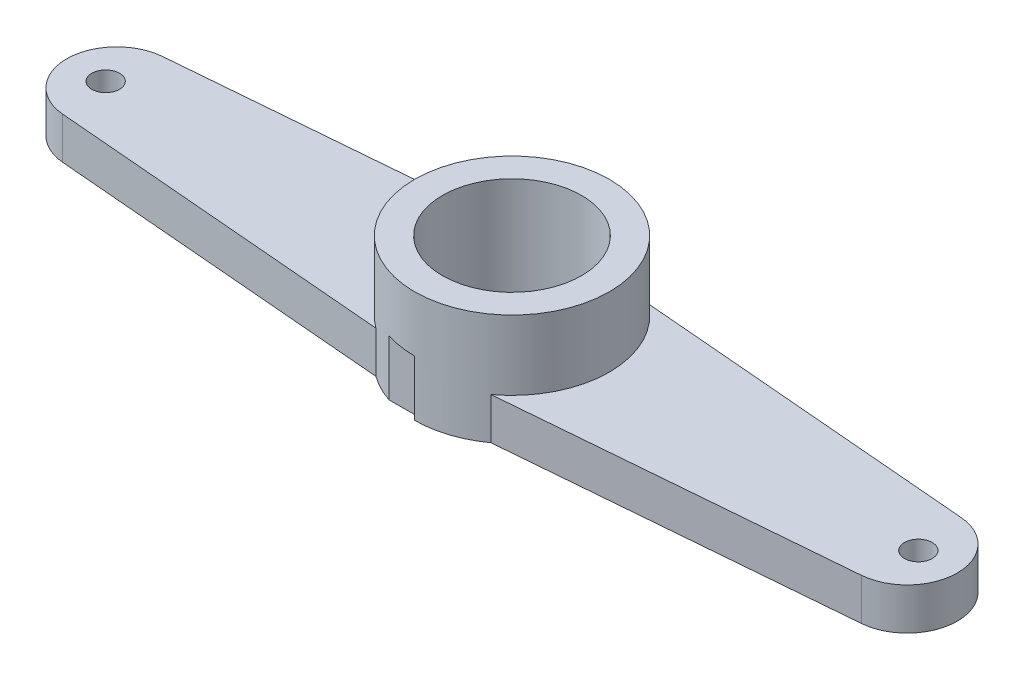
ISO-10303-21;
HEADER;
FILE_DESCRIPTION(('STEP AP214'),'2;1');
FILE_NAME('part.step','',(''),(''),'','','');
FILE_SCHEMA(('AUTOMOTIVE_DESIGN { 1 0 10303 214 1 1 1 1 }'));
ENDSEC;
DATA;
#1=APPLICATION_CONTEXT('core data for automotive mechanical design processes');
#2=APPLICATION_PROTOCOL_DEFINITION('international standard','automotive_design',2000,#1);
#3=PRODUCT_CONTEXT('',#1,'mechanical');
#4=PRODUCT('Part','Part','',(#3));
#5=PRODUCT_RELATED_PRODUCT_CATEGORY('part','',(#4));
#6=PRODUCT_DEFINITION_FORMATION('','',#4);
#7=PRODUCT_DEFINITION_CONTEXT('part definition',#1,'design');
#8=PRODUCT_DEFINITION('design','',#6,#7);
#9=PRODUCT_DEFINITION_SHAPE('','',#8);
#10=(LENGTH_UNIT() NAMED_UNIT(*) SI_UNIT(.MILLI.,.METRE.));
#11=(NAMED_UNIT(*) PLANE_ANGLE_UNIT() SI_UNIT($,.RADIAN.));
#12=(NAMED_UNIT(*) SI_UNIT($,.STERADIAN.) SOLID_ANGLE_UNIT());
#13=UNCERTAINTY_MEASURE_WITH_UNIT(LENGTH_MEASURE(1.E-05),#10,'distance_accuracy_value','');
#14=(GEOMETRIC_REPRESENTATION_CONTEXT(3) GLOBAL_UNCERTAINTY_ASSIGNED_CONTEXT((#13)) GLOBAL_UNIT_ASSIGNED_CONTEXT((#10,
#11,#12)) REPRESENTATION_CONTEXT('',''));
#15=CARTESIAN_POINT('',(0.,0.,0.));
#16=DIRECTION('',(0.,0.,1.));
#17=DIRECTION('',(1.,0.,0.));
#18=AXIS2_PLACEMENT_3D('',#15,#16,#17);
#19=CARTESIAN_POINT('',(-1.,-1.,0.999999999999997));
#20=DIRECTION('',(0.,0.,1.));
#21=DIRECTION('',(1.,0.,0.));
#22=AXIS2_PLACEMENT_3D('',#19,#20,#21);
#23=PLANE('',#22);
#24=DIRECTION('',(1.,0.,0.));
#25=VECTOR('',#24,1.);
#26=CARTESIAN_POINT('',(-1.,0.,0.999999999999997));
#27=LINE('',#26,#25);
#28=CARTESIAN_POINT('',(-1.,0.,0.999999999999997));
#29=VERTEX_POINT('',#28);
#30=CARTESIAN_POINT('',(0.999999999999997,0.,0.999999999999997));
#31=VERTEX_POINT('',#30);
#32=EDGE_CURVE('E121',#29,#31,#27,.T.);
#33=ORIENTED_EDGE('',*,*,#32,.F.);
#34=DIRECTION('',(0.,1.,0.));
#35=VECTOR('',#34,1.);
#36=CARTESIAN_POINT('',(-1.,-1.,0.999999999999997));
#37=LINE('',#36,#35);
#38=CARTESIAN_POINT('',(-1.,-1.,0.999999999999997));
#39=VERTEX_POINT('',#38);
#40=EDGE_CURVE('E12',#39,#29,#37,.T.);
#41=ORIENTED_EDGE('',*,*,#40,.F.);
#42=DIRECTION('',(1.,0.,0.));
#43=VECTOR('',#42,1.);
#44=CARTESIAN_POINT('',(-1.,-1.,0.999999999999997));
#45=LINE('',#44,#43);
#46=CARTESIAN_POINT('',(0.999999999999997,-1.,0.999999999999997));
#47=VERTEX_POINT('',#46);
#48=EDGE_CURVE('E115',#39,#47,#45,.T.);
#49=ORIENTED_EDGE('',*,*,#48,.T.);
#50=DIRECTION('',(0.,1.,0.));
#51=VECTOR('',#50,1.);
#52=CARTESIAN_POINT('',(0.999999999999997,-1.,0.999999999999997));
#53=LINE('',#52,#51);
#54=EDGE_CURVE('E60',#47,#31,#53,.T.);
#55=ORIENTED_EDGE('',*,*,#54,.T.);
#56=EDGE_LOOP('',(#33,#41,#49,#55));
#57=FACE_BOUND('',#56,.T.);
#58=ADVANCED_FACE('F57',(#57),#23,.T.);
#59=CARTESIAN_POINT('',(-1.,-1.,-1.));
#60=DIRECTION('',(-1.,0.,0.));
#61=DIRECTION('',(0.,0.,1.));
#62=AXIS2_PLACEMENT_3D('',#59,#60,#61);
#63=PLANE('',#62);
#64=DIRECTION('',(0.,0.,1.));
#65=VECTOR('',#64,1.);
#66=CARTESIAN_POINT('',(-1.,0.,-1.));
#67=LINE('',#66,#65);
#68=CARTESIAN_POINT('',(-1.,0.,-1.));
#69=VERTEX_POINT('',#68);
#70=EDGE_CURVE('E117',#69,#29,#67,.T.);
#71=ORIENTED_EDGE('',*,*,#70,.F.);
#72=DIRECTION('',(0.,1.,0.));
#73=VECTOR('',#72,1.);
#74=CARTESIAN_POINT('',(-1.,-1.,-1.));
#75=LINE('',#74,#73);
#76=CARTESIAN_POINT('',(-1.,-1.,-1.));
#77=VERTEX_POINT('',#76);
#78=EDGE_CURVE('E66',#77,#69,#75,.T.);
#79=ORIENTED_EDGE('',*,*,#78,.F.);
#80=DIRECTION('',(0.,0.,1.));
#81=VECTOR('',#80,1.);
#82=CARTESIAN_POINT('',(-1.,-1.,-1.));
#83=LINE('',#82,#81);
#84=EDGE_CURVE('E105',#77,#39,#83,.T.);
#85=ORIENTED_EDGE('',*,*,#84,.T.);
#86=ORIENTED_EDGE('',*,*,#40,.T.);
#87=EDGE_LOOP('',(#71,#79,#85,#86));
#88=FACE_BOUND('',#87,.T.);
#89=ADVANCED_FACE('F131',(#88),#63,.T.);
#90=CARTESIAN_POINT('',(-1.,-1.,-1.));
#91=DIRECTION('',(0.,0.,1.));
#92=DIRECTION('',(1.,0.,0.));
#93=AXIS2_PLACEMENT_3D('',#90,#91,#92);
#94=PLANE('',#93);
#95=DIRECTION('',(1.,0.,0.));
#96=VECTOR('',#95,1.);
#97=CARTESIAN_POINT('',(-1.,0.,-1.));
#98=LINE('',#97,#96);
#99=CARTESIAN_POINT('',(0.999999999999997,0.,-1.));
#100=VERTEX_POINT('',#99);
#101=EDGE_CURVE('E110',#69,#100,#98,.T.);
#102=ORIENTED_EDGE('',*,*,#101,.T.);
#103=DIRECTION('',(0.,1.,0.));
#104=VECTOR('',#103,1.);
#105=CARTESIAN_POINT('',(0.999999999999997,-1.,-1.));
#106=LINE('',#105,#104);
#107=CARTESIAN_POINT('',(0.999999999999997,-1.,-1.));
#108=VERTEX_POINT('',#107);
#109=EDGE_CURVE('E108',#108,#100,#106,.T.);
#110=ORIENTED_EDGE('',*,*,#109,.F.);
#111=DIRECTION('',(1.,0.,0.));
#112=VECTOR('',#111,1.);
#113=CARTESIAN_POINT('',(-1.,-1.,-1.));
#114=LINE('',#113,#112);
#115=EDGE_CURVE('E102',#77,#108,#114,.T.);
#116=ORIENTED_EDGE('',*,*,#115,.F.);
#117=ORIENTED_EDGE('',*,*,#78,.T.);
#118=EDGE_LOOP('',(#102,#110,#116,#117));
#119=FACE_BOUND('',#118,.T.);
#120=ADVANCED_FACE('F109',(#119),#94,.F.);
#121=CARTESIAN_POINT('',(0.999999999999997,-1.,-1.));
#122=DIRECTION('',(-1.,0.,0.));
#123=DIRECTION('',(0.,0.,1.));
#124=AXIS2_PLACEMENT_3D('',#121,#122,#123);
#125=PLANE('',#124);
#126=DIRECTION('',(0.,0.,1.));
#127=VECTOR('',#126,1.);
#128=CARTESIAN_POINT('',(0.999999999999997,0.,-1.));
#129=LINE('',#128,#127);
#130=EDGE_CURVE('E124',#100,#31,#129,.T.);
#131=ORIENTED_EDGE('',*,*,#130,.T.);
#132=ORIENTED_EDGE('',*,*,#54,.F.);
#133=DIRECTION('',(0.,0.,1.));
#134=VECTOR('',#133,1.);
#135=CARTESIAN_POINT('',(0.999999999999997,-1.,-1.));
#136=LINE('',#135,#134);
#137=EDGE_CURVE('E99',#108,#47,#136,.T.);
#138=ORIENTED_EDGE('',*,*,#137,.F.);
#139=ORIENTED_EDGE('',*,*,#109,.T.);
#140=EDGE_LOOP('',(#131,#132,#138,#139));
#141=FACE_BOUND('',#140,.T.);
#142=ADVANCED_FACE('F114',(#141),#125,.F.);
#143=CARTESIAN_POINT('',(0.,-1.,0.));
#144=DIRECTION('',(0.,-1.,0.));
#145=DIRECTION('',(0.,0.,-1.));
#146=AXIS2_PLACEMENT_3D('',#143,#144,#145);
#147=PLANE('',#146);
#148=ORIENTED_EDGE('',*,*,#48,.F.);
#149=ORIENTED_EDGE('',*,*,#84,.F.);
#150=ORIENTED_EDGE('',*,*,#115,.T.);
#151=ORIENTED_EDGE('',*,*,#137,.T.);
#152=EDGE_LOOP('',(#148,#149,#150,#151));
#153=FACE_BOUND('',#152,.T.);
#154=ADVANCED_FACE('F104',(#153),#147,.T.);
#155=CARTESIAN_POINT('',(0.,0.,0.));
#156=DIRECTION('',(0.,-1.,0.));
#157=DIRECTION('',(0.,0.,-1.));
#158=AXIS2_PLACEMENT_3D('',#155,#156,#157);
#159=PLANE('',#158);
#160=ORIENTED_EDGE('',*,*,#32,.T.);
#161=ORIENTED_EDGE('',*,*,#130,.F.);
#162=ORIENTED_EDGE('',*,*,#101,.F.);
#163=ORIENTED_EDGE('',*,*,#70,.T.);
#164=EDGE_LOOP('',(#160,#161,#162,#163));
#165=FACE_BOUND('',#164,.T.);
#166=ADVANCED_FACE('F130',(#165),#159,.F.);
#167=CLOSED_SHELL('',(#58,#89,#120,#142,#154,#166));
#168=MANIFOLD_SOLID_BREP('B2',#167);
#169=CARTESIAN_POINT('',(0.,0.,0.));
#170=DIRECTION('',(0.,1.,0.));
#171=DIRECTION('',(0.,0.,1.));
#172=AXIS2_PLACEMENT_3D('',#169,#170,#171);
#173=PLANE('',#172);
#174=CARTESIAN_POINT('',(0.,0.,0.));
#175=DIRECTION('',(0.,1.,0.));
#176=DIRECTION('',(0.,0.,1.));
#177=AXIS2_PLACEMENT_3D('',#174,#175,#176);
#178=CIRCLE('',#177,2.5);
#179=CARTESIAN_POINT('',(0.,0.,2.5));
#180=VERTEX_POINT('',#179);
#181=EDGE_CURVE('E302',#180,#180,#178,.T.);
#182=ORIENTED_EDGE('',*,*,#181,.T.);
#183=EDGE_LOOP('',(#182));
#184=FACE_BOUND('',#183,.T.);
#185=CARTESIAN_POINT('',(-14.6,0.,0.));
#186=DIRECTION('',(0.,-1.,0.));
#187=DIRECTION('',(0.,0.,-1.));
#188=AXIS2_PLACEMENT_3D('',#185,#186,#187);
#189=CIRCLE('',#188,0.500000000000001);
#190=CARTESIAN_POINT('',(-14.6,0.,-0.500000000000001));
#191=VERTEX_POINT('',#190);
#192=EDGE_CURVE('E291',#191,#191,#189,.T.);
#193=ORIENTED_EDGE('',*,*,#192,.F.);
#194=EDGE_LOOP('',(#193));
#195=FACE_BOUND('',#194,.T.);
#196=CARTESIAN_POINT('',(14.6,0.,0.));
#197=DIRECTION('',(0.,-1.,0.));
#198=DIRECTION('',(0.,0.,-1.));
#199=AXIS2_PLACEMENT_3D('',#196,#197,#198);
#200=CIRCLE('',#199,0.500000000000001);
#201=CARTESIAN_POINT('',(14.6,0.,-0.500000000000001));
#202=VERTEX_POINT('',#201);
#203=EDGE_CURVE('E293',#202,#202,#200,.T.);
#204=ORIENTED_EDGE('',*,*,#203,.F.);
#205=EDGE_LOOP('',(#204));
#206=FACE_BOUND('',#205,.T.);
#207=DIRECTION('',(-0.999972388609505,0.,0.00743115190276102));
#208=VECTOR('',#207,1.);
#209=CARTESIAN_POINT('',(0.0246524616307878,0.,3.31735661773833));
#210=LINE('',#209,#208);
#211=CARTESIAN_POINT('',(0.,0.,3.31753981898392));
#212=VERTEX_POINT('',#211);
#213=CARTESIAN_POINT('',(-1.09012775601148,0.,3.32564094761569));
#214=VERTEX_POINT('',#213);
#215=EDGE_CURVE('E271',#212,#214,#210,.T.);
#216=ORIENTED_EDGE('',*,*,#215,.T.);
#217=CARTESIAN_POINT('',(0.,0.,0.));
#218=DIRECTION('',(0.,1.,0.));
#219=DIRECTION('',(0.,0.,1.));
#220=AXIS2_PLACEMENT_3D('',#217,#218,#219);
#221=CIRCLE('',#220,3.49975231079069);
#222=CARTESIAN_POINT('',(-2.06374452222937,0.,2.82652167581518));
#223=VERTEX_POINT('',#222);
#224=EDGE_CURVE('E338',#223,#214,#221,.T.);
#225=ORIENTED_EDGE('',*,*,#224,.F.);
#226=DIRECTION('',(0.99648557382835,0.,0.08376455785106));
#227=VECTOR('',#226,1.);
#228=CARTESIAN_POINT('',(-0.250410520490075,0.,2.97895049654405));
#229=LINE('',#228,#227);
#230=CARTESIAN_POINT('',(-14.3507762041319,0.,1.79367403289103));
#231=VERTEX_POINT('',#230);
#232=EDGE_CURVE('E357',#231,#223,#229,.T.);
#233=ORIENTED_EDGE('',*,*,#232,.F.);
#234=CARTESIAN_POINT('',(-14.2,0.,0.));
#235=DIRECTION('',(0.,1.,0.));
#236=DIRECTION('',(0.,0.,1.));
#237=AXIS2_PLACEMENT_3D('',#234,#235,#236);
#238=CIRCLE('',#237,1.8);
#239=CARTESIAN_POINT('',(-14.3507762041319,0.,-1.79367403289103));
#240=VERTEX_POINT('',#239);
#241=EDGE_CURVE('E337',#240,#231,#238,.T.);
#242=ORIENTED_EDGE('',*,*,#241,.F.);
#243=DIRECTION('',(0.99648557382835,0.,-0.08376455785106));
#244=VECTOR('',#243,1.);
#245=CARTESIAN_POINT('',(-0.250410520490075,0.,-2.97895049654405));
#246=LINE('',#245,#244);
#247=CARTESIAN_POINT('',(-2.06374452222938,0.,-2.82652167581518));
#248=VERTEX_POINT('',#247);
#249=EDGE_CURVE('E346',#240,#248,#246,.T.);
#250=ORIENTED_EDGE('',*,*,#249,.T.);
#251=CARTESIAN_POINT('',(2.06374452222937,0.,-2.82652167581518));
#252=VERTEX_POINT('',#251);
#253=EDGE_CURVE('E333',#252,#248,#221,.T.);
#254=ORIENTED_EDGE('',*,*,#253,.F.);
#255=DIRECTION('',(-0.99648557382835,0.,-0.0837645578510595));
#256=VECTOR('',#255,1.);
#257=CARTESIAN_POINT('',(0.250410520490073,0.,-2.97895049654405));
#258=LINE('',#257,#256);
#259=CARTESIAN_POINT('',(14.3507762041319,0.,-1.79367403289104));
#260=VERTEX_POINT('',#259);
#261=EDGE_CURVE('E310',#260,#252,#258,.T.);
#262=ORIENTED_EDGE('',*,*,#261,.F.);
#263=CARTESIAN_POINT('',(14.2,0.,0.));
#264=DIRECTION('',(0.,1.,0.));
#265=DIRECTION('',(0.,0.,1.));
#266=AXIS2_PLACEMENT_3D('',#263,#264,#265);
#267=CIRCLE('',#266,1.8);
#268=CARTESIAN_POINT('',(14.3507762041319,0.,1.79367403289103));
#269=VERTEX_POINT('',#268);
#270=EDGE_CURVE('E320',#269,#260,#267,.T.);
#271=ORIENTED_EDGE('',*,*,#270,.F.);
#272=DIRECTION('',(-0.99648557382835,0.,0.0837645578510602));
#273=VECTOR('',#272,1.);
#274=CARTESIAN_POINT('',(0.250410520490075,0.,2.97895049654405));
#275=LINE('',#274,#273);
#276=CARTESIAN_POINT('',(2.06374452222936,0.,2.82652167581518));
#277=VERTEX_POINT('',#276);
#278=EDGE_CURVE('E305',#269,#277,#275,.T.);
#279=ORIENTED_EDGE('',*,*,#278,.T.);
#280=CARTESIAN_POINT('',(0.,0.,3.49975231079069));
#281=VERTEX_POINT('',#280);
#282=EDGE_CURVE('E341',#281,#277,#221,.T.);
#283=ORIENTED_EDGE('',*,*,#282,.F.);
#284=DIRECTION('',(0.,0.,1.));
#285=VECTOR('',#284,1.);
#286=CARTESIAN_POINT('',(0.,0.,0.));
#287=LINE('',#286,#285);
#288=EDGE_CURVE('E280',#212,#281,#287,.T.);
#289=ORIENTED_EDGE('',*,*,#288,.F.);
#290=EDGE_LOOP('',(#216,#225,#233,#242,#250,#254,#262,#271,#279,#283,#289));
#291=FACE_BOUND('',#290,.T.);
#292=ADVANCED_FACE('F181',(#184,#195,#206,#291),#173,.F.);
#293=CARTESIAN_POINT('',(0.,4.,0.));
#294=DIRECTION('',(0.,-1.,0.));
#295=DIRECTION('',(0.,0.,-1.));
#296=AXIS2_PLACEMENT_3D('',#293,#294,#295);
#297=CYLINDRICAL_SURFACE('',#296,3.49975231079069);
#298=CARTESIAN_POINT('',(0.,4.,0.));
#299=DIRECTION('',(0.,1.,0.));
#300=DIRECTION('',(0.,0.,1.));
#301=AXIS2_PLACEMENT_3D('',#298,#299,#300);
#302=CIRCLE('',#301,3.49975231079069);
#303=CARTESIAN_POINT('',(0.,4.,3.49975231079069));
#304=VERTEX_POINT('',#303);
#305=EDGE_CURVE('E334',#304,#304,#302,.T.);
#306=ORIENTED_EDGE('',*,*,#305,.F.);
#307=EDGE_LOOP('',(#306));
#308=FACE_BOUND('',#307,.T.);
#309=DIRECTION('',(0.,-1.,0.));
#310=VECTOR('',#309,1.);
#311=CARTESIAN_POINT('',(-1.09012775601148,2.,3.32564094761569));
#312=LINE('',#311,#310);
#313=CARTESIAN_POINT('',(-1.09012775601148,2.,3.32564094761569));
#314=VERTEX_POINT('',#313);
#315=EDGE_CURVE('E289',#314,#214,#312,.T.);
#316=ORIENTED_EDGE('',*,*,#315,.F.);
#317=CARTESIAN_POINT('',(0.,2.,0.));
#318=DIRECTION('',(0.,-1.,0.));
#319=DIRECTION('',(0.,0.,-1.));
#320=AXIS2_PLACEMENT_3D('',#317,#318,#319);
#321=CIRCLE('',#320,3.49975231079069);
#322=CARTESIAN_POINT('',(0.,2.,3.49975231079069));
#323=VERTEX_POINT('',#322);
#324=EDGE_CURVE('E275',#323,#314,#321,.T.);
#325=ORIENTED_EDGE('',*,*,#324,.F.);
#326=DIRECTION('',(0.,-1.,0.));
#327=VECTOR('',#326,1.);
#328=CARTESIAN_POINT('',(0.,2.,3.49975231079069));
#329=LINE('',#328,#327);
#330=EDGE_CURVE('E274',#323,#281,#329,.T.);
#331=ORIENTED_EDGE('',*,*,#330,.T.);
#332=ORIENTED_EDGE('',*,*,#282,.T.);
#333=DIRECTION('',(0.,-1.,0.));
#334=VECTOR('',#333,1.);
#335=CARTESIAN_POINT('',(2.06374452222936,1.5,2.82652167581518));
#336=LINE('',#335,#334);
#337=CARTESIAN_POINT('',(2.06374452222936,1.5,2.82652167581518));
#338=VERTEX_POINT('',#337);
#339=EDGE_CURVE('E330',#338,#277,#336,.T.);
#340=ORIENTED_EDGE('',*,*,#339,.F.);
#341=CARTESIAN_POINT('',(0.,1.5,0.));
#342=DIRECTION('',(0.,1.,0.));
#343=DIRECTION('',(0.,0.,1.));
#344=AXIS2_PLACEMENT_3D('',#341,#342,#343);
#345=CIRCLE('',#344,3.49975231079069);
#346=CARTESIAN_POINT('',(2.06374452222937,1.5,-2.82652167581518));
#347=VERTEX_POINT('',#346);
#348=EDGE_CURVE('E205',#338,#347,#345,.T.);
#349=ORIENTED_EDGE('',*,*,#348,.T.);
#350=DIRECTION('',(0.,-1.,0.));
#351=VECTOR('',#350,1.);
#352=CARTESIAN_POINT('',(2.06374452222937,1.5,-2.82652167581518));
#353=LINE('',#352,#351);
#354=EDGE_CURVE('E317',#347,#252,#353,.T.);
#355=ORIENTED_EDGE('',*,*,#354,.T.);
#356=ORIENTED_EDGE('',*,*,#253,.T.);
#357=DIRECTION('',(0.,-1.,0.));
#358=VECTOR('',#357,1.);
#359=CARTESIAN_POINT('',(-2.06374452222938,1.5,-2.82652167581518));
#360=LINE('',#359,#358);
#361=CARTESIAN_POINT('',(-2.06374452222938,1.5,-2.82652167581518));
#362=VERTEX_POINT('',#361);
#363=EDGE_CURVE('E363',#362,#248,#360,.T.);
#364=ORIENTED_EDGE('',*,*,#363,.F.);
#365=CARTESIAN_POINT('',(0.,1.5,0.));
#366=DIRECTION('',(0.,1.,0.));
#367=DIRECTION('',(0.,0.,1.));
#368=AXIS2_PLACEMENT_3D('',#365,#366,#367);
#369=CIRCLE('',#368,3.49975231079069);
#370=CARTESIAN_POINT('',(-2.06374452222937,1.5,2.82652167581518));
#371=VERTEX_POINT('',#370);
#372=EDGE_CURVE('E349',#362,#371,#369,.T.);
#373=ORIENTED_EDGE('',*,*,#372,.T.);
#374=DIRECTION('',(0.,-1.,0.));
#375=VECTOR('',#374,1.);
#376=CARTESIAN_POINT('',(-2.06374452222937,1.5,2.82652167581518));
#377=LINE('',#376,#375);
#378=EDGE_CURVE('E190',#371,#223,#377,.T.);
#379=ORIENTED_EDGE('',*,*,#378,.T.);
#380=ORIENTED_EDGE('',*,*,#224,.T.);
#381=EDGE_LOOP('',(#316,#325,#331,#332,#340,#349,#355,#356,#364,#373,#379,#380));
#382=FACE_BOUND('',#381,.T.);
#383=ADVANCED_FACE('F368',(#308,#382),#297,.T.);
#384=CARTESIAN_POINT('',(-14.2,1.5,0.));
#385=DIRECTION('',(0.,-1.,0.));
#386=DIRECTION('',(0.,0.,-1.));
#387=AXIS2_PLACEMENT_3D('',#384,#385,#386);
#388=CYLINDRICAL_SURFACE('',#387,1.8);
#389=ORIENTED_EDGE('',*,*,#241,.T.);
#390=DIRECTION('',(0.,-1.,0.));
#391=VECTOR('',#390,1.);
#392=CARTESIAN_POINT('',(-14.3507762041319,1.5,1.79367403289103));
#393=LINE('',#392,#391);
#394=CARTESIAN_POINT('',(-14.3507762041319,1.5,1.79367403289103));
#395=VERTEX_POINT('',#394);
#396=EDGE_CURVE('E55',#395,#231,#393,.T.);
#397=ORIENTED_EDGE('',*,*,#396,.F.);
#398=CARTESIAN_POINT('',(-14.2,1.5,0.));
#399=DIRECTION('',(0.,1.,0.));
#400=DIRECTION('',(0.,0.,1.));
#401=AXIS2_PLACEMENT_3D('',#398,#399,#400);
#402=CIRCLE('',#401,1.8);
#403=CARTESIAN_POINT('',(-14.3507762041319,1.5,-1.79367403289103));
#404=VERTEX_POINT('',#403);
#405=EDGE_CURVE('E342',#404,#395,#402,.T.);
#406=ORIENTED_EDGE('',*,*,#405,.F.);
#407=DIRECTION('',(0.,-1.,0.));
#408=VECTOR('',#407,1.);
#409=CARTESIAN_POINT('',(-14.3507762041319,1.5,-1.79367403289103));
#410=LINE('',#409,#408);
#411=EDGE_CURVE('E354',#404,#240,#410,.T.);
#412=ORIENTED_EDGE('',*,*,#411,.T.);
#413=EDGE_LOOP('',(#389,#397,#406,#412));
#414=FACE_BOUND('',#413,.T.);
#415=ADVANCED_FACE('F183',(#414),#388,.T.);
#416=CARTESIAN_POINT('',(-0.250410520490075,1.5,2.97895049654405));
#417=DIRECTION('',(0.08376455785106,0.,-0.99648557382835));
#418=DIRECTION('',(-0.99648557382835,0.,-0.08376455785106));
#419=AXIS2_PLACEMENT_3D('',#416,#417,#418);
#420=PLANE('',#419);
#421=ORIENTED_EDGE('',*,*,#232,.T.);
#422=ORIENTED_EDGE('',*,*,#378,.F.);
#423=DIRECTION('',(0.99648557382835,0.,0.08376455785106));
#424=VECTOR('',#423,1.);
#425=CARTESIAN_POINT('',(-0.250410520490075,1.5,2.97895049654405));
#426=LINE('',#425,#424);
#427=EDGE_CURVE('E345',#395,#371,#426,.T.);
#428=ORIENTED_EDGE('',*,*,#427,.F.);
#429=ORIENTED_EDGE('',*,*,#396,.T.);
#430=EDGE_LOOP('',(#421,#422,#428,#429));
#431=FACE_BOUND('',#430,.T.);
#432=ADVANCED_FACE('F371',(#431),#420,.F.);
#433=CARTESIAN_POINT('',(-0.250410520490075,1.5,-2.97895049654405));
#434=DIRECTION('',(-0.08376455785106,0.,-0.99648557382835));
#435=DIRECTION('',(-0.99648557382835,0.,0.08376455785106));
#436=AXIS2_PLACEMENT_3D('',#433,#434,#435);
#437=PLANE('',#436);
#438=ORIENTED_EDGE('',*,*,#249,.F.);
#439=ORIENTED_EDGE('',*,*,#411,.F.);
#440=DIRECTION('',(0.99648557382835,0.,-0.08376455785106));
#441=VECTOR('',#440,1.);
#442=CARTESIAN_POINT('',(-0.250410520490075,1.5,-2.97895049654405));
#443=LINE('',#442,#441);
#444=EDGE_CURVE('E351',#404,#362,#443,.T.);
#445=ORIENTED_EDGE('',*,*,#444,.T.);
#446=ORIENTED_EDGE('',*,*,#363,.T.);
#447=EDGE_LOOP('',(#438,#439,#445,#446));
#448=FACE_BOUND('',#447,.T.);
#449=ADVANCED_FACE('F421',(#448),#437,.T.);
#450=CARTESIAN_POINT('',(0.,1.5,0.));
#451=DIRECTION('',(0.,1.,0.));
#452=DIRECTION('',(0.,0.,1.));
#453=AXIS2_PLACEMENT_3D('',#450,#451,#452);
#454=PLANE('',#453);
#455=CARTESIAN_POINT('',(-14.6,1.5,0.));
#456=DIRECTION('',(0.,1.,0.));
#457=DIRECTION('',(0.,0.,1.));
#458=AXIS2_PLACEMENT_3D('',#455,#456,#457);
#459=CIRCLE('',#458,0.500000000000001);
#460=CARTESIAN_POINT('',(-14.6,1.5,0.500000000000001));
#461=VERTEX_POINT('',#460);
#462=EDGE_CURVE('E298',#461,#461,#459,.T.);
#463=ORIENTED_EDGE('',*,*,#462,.F.);
#464=EDGE_LOOP('',(#463));
#465=FACE_BOUND('',#464,.T.);
#466=ORIENTED_EDGE('',*,*,#405,.T.);
#467=ORIENTED_EDGE('',*,*,#427,.T.);
#468=ORIENTED_EDGE('',*,*,#372,.F.);
#469=ORIENTED_EDGE('',*,*,#444,.F.);
#470=EDGE_LOOP('',(#466,#467,#468,#469));
#471=FACE_BOUND('',#470,.T.);
#472=ADVANCED_FACE('F420',(#465,#471),#454,.T.);
#473=CARTESIAN_POINT('',(0.,4.,0.));
#474=DIRECTION('',(0.,1.,0.));
#475=DIRECTION('',(0.,0.,1.));
#476=AXIS2_PLACEMENT_3D('',#473,#474,#475);
#477=PLANE('',#476);
#478=CARTESIAN_POINT('',(0.,4.,0.));
#479=DIRECTION('',(0.,1.,0.));
#480=DIRECTION('',(0.,0.,1.));
#481=AXIS2_PLACEMENT_3D('',#478,#479,#480);
#482=CIRCLE('',#481,2.5);
#483=CARTESIAN_POINT('',(0.,4.,2.5));
#484=VERTEX_POINT('',#483);
#485=EDGE_CURVE('E301',#484,#484,#482,.T.);
#486=ORIENTED_EDGE('',*,*,#485,.F.);
#487=EDGE_LOOP('',(#486));
#488=FACE_BOUND('',#487,.T.);
#489=ORIENTED_EDGE('',*,*,#305,.T.);
#490=EDGE_LOOP('',(#489));
#491=FACE_BOUND('',#490,.T.);
#492=ADVANCED_FACE('F434',(#488,#491),#477,.T.);
#493=CARTESIAN_POINT('',(0.250410520490075,1.5,2.97895049654405));
#494=DIRECTION('',(0.0837645578510602,0.,0.99648557382835));
#495=DIRECTION('',(0.99648557382835,0.,-0.0837645578510602));
#496=AXIS2_PLACEMENT_3D('',#493,#494,#495);
#497=PLANE('',#496);
#498=ORIENTED_EDGE('',*,*,#278,.F.);
#499=DIRECTION('',(0.,-1.,0.));
#500=VECTOR('',#499,1.);
#501=CARTESIAN_POINT('',(14.3507762041319,1.5,1.79367403289103));
#502=LINE('',#501,#500);
#503=CARTESIAN_POINT('',(14.3507762041319,1.5,1.79367403289103));
#504=VERTEX_POINT('',#503);
#505=EDGE_CURVE('E328',#504,#269,#502,.T.);
#506=ORIENTED_EDGE('',*,*,#505,.F.);
#507=DIRECTION('',(-0.99648557382835,0.,0.0837645578510602));
#508=VECTOR('',#507,1.);
#509=CARTESIAN_POINT('',(0.250410520490075,1.5,2.97895049654405));
#510=LINE('',#509,#508);
#511=EDGE_CURVE('E309',#504,#338,#510,.T.);
#512=ORIENTED_EDGE('',*,*,#511,.T.);
#513=ORIENTED_EDGE('',*,*,#339,.T.);
#514=EDGE_LOOP('',(#498,#506,#512,#513));
#515=FACE_BOUND('',#514,.T.);
#516=ADVANCED_FACE('F379',(#515),#497,.T.);
#517=CARTESIAN_POINT('',(14.2,1.5,0.));
#518=DIRECTION('',(0.,-1.,0.));
#519=DIRECTION('',(0.,0.,-1.));
#520=AXIS2_PLACEMENT_3D('',#517,#518,#519);
#521=CYLINDRICAL_SURFACE('',#520,1.8);
#522=ORIENTED_EDGE('',*,*,#270,.T.);
#523=DIRECTION('',(0.,-1.,0.));
#524=VECTOR('',#523,1.);
#525=CARTESIAN_POINT('',(14.3507762041319,1.5,-1.79367403289104));
#526=LINE('',#525,#524);
#527=CARTESIAN_POINT('',(14.3507762041319,1.5,-1.79367403289104));
#528=VERTEX_POINT('',#527);
#529=EDGE_CURVE('E325',#528,#260,#526,.T.);
#530=ORIENTED_EDGE('',*,*,#529,.F.);
#531=CARTESIAN_POINT('',(14.2,1.5,0.));
#532=DIRECTION('',(0.,1.,0.));
#533=DIRECTION('',(0.,0.,1.));
#534=AXIS2_PLACEMENT_3D('',#531,#532,#533);
#535=CIRCLE('',#534,1.8);
#536=EDGE_CURVE('E313',#504,#528,#535,.T.);
#537=ORIENTED_EDGE('',*,*,#536,.F.);
#538=ORIENTED_EDGE('',*,*,#505,.T.);
#539=EDGE_LOOP('',(#522,#530,#537,#538));
#540=FACE_BOUND('',#539,.T.);
#541=ADVANCED_FACE('F385',(#540),#521,.T.);
#542=CARTESIAN_POINT('',(0.250410520490073,1.5,-2.97895049654405));
#543=DIRECTION('',(-0.0837645578510595,0.,0.99648557382835));
#544=DIRECTION('',(0.99648557382835,0.,0.0837645578510595));
#545=AXIS2_PLACEMENT_3D('',#542,#543,#544);
#546=PLANE('',#545);
#547=ORIENTED_EDGE('',*,*,#261,.T.);
#548=ORIENTED_EDGE('',*,*,#354,.F.);
#549=DIRECTION('',(-0.99648557382835,0.,-0.0837645578510595));
#550=VECTOR('',#549,1.);
#551=CARTESIAN_POINT('',(0.250410520490073,1.5,-2.97895049654405));
#552=LINE('',#551,#550);
#553=EDGE_CURVE('E315',#528,#347,#552,.T.);
#554=ORIENTED_EDGE('',*,*,#553,.F.);
#555=ORIENTED_EDGE('',*,*,#529,.T.);
#556=EDGE_LOOP('',(#547,#548,#554,#555));
#557=FACE_BOUND('',#556,.T.);
#558=ADVANCED_FACE('F389',(#557),#546,.F.);
#559=CARTESIAN_POINT('',(0.,1.5,0.));
#560=DIRECTION('',(0.,1.,0.));
#561=DIRECTION('',(0.,0.,1.));
#562=AXIS2_PLACEMENT_3D('',#559,#560,#561);
#563=PLANE('',#562);
#564=CARTESIAN_POINT('',(14.6,1.5,0.));
#565=DIRECTION('',(0.,1.,0.));
#566=DIRECTION('',(0.,0.,1.));
#567=AXIS2_PLACEMENT_3D('',#564,#565,#566);
#568=CIRCLE('',#567,0.500000000000001);
#569=CARTESIAN_POINT('',(14.6,1.5,0.500000000000001));
#570=VERTEX_POINT('',#569);
#571=EDGE_CURVE('E185',#570,#570,#568,.T.);
#572=ORIENTED_EDGE('',*,*,#571,.F.);
#573=EDGE_LOOP('',(#572));
#574=FACE_BOUND('',#573,.T.);
#575=ORIENTED_EDGE('',*,*,#348,.F.);
#576=ORIENTED_EDGE('',*,*,#511,.F.);
#577=ORIENTED_EDGE('',*,*,#536,.T.);
#578=ORIENTED_EDGE('',*,*,#553,.T.);
#579=EDGE_LOOP('',(#575,#576,#577,#578));
#580=FACE_BOUND('',#579,.T.);
#581=ADVANCED_FACE('F392',(#574,#580),#563,.T.);
#582=CARTESIAN_POINT('',(0.,0.,0.));
#583=DIRECTION('',(0.,1.,0.));
#584=DIRECTION('',(0.,0.,1.));
#585=AXIS2_PLACEMENT_3D('',#582,#583,#584);
#586=CYLINDRICAL_SURFACE('',#585,2.5);
#587=ORIENTED_EDGE('',*,*,#181,.F.);
#588=EDGE_LOOP('',(#587));
#589=FACE_BOUND('',#588,.T.);
#590=ORIENTED_EDGE('',*,*,#485,.T.);
#591=EDGE_LOOP('',(#590));
#592=FACE_BOUND('',#591,.T.);
#593=ADVANCED_FACE('F394',(#589,#592),#586,.F.);
#594=CARTESIAN_POINT('',(14.6,4.,0.));
#595=DIRECTION('',(0.,-1.,0.));
#596=DIRECTION('',(0.,0.,-1.));
#597=AXIS2_PLACEMENT_3D('',#594,#595,#596);
#598=CYLINDRICAL_SURFACE('',#597,0.500000000000001);
#599=ORIENTED_EDGE('',*,*,#571,.T.);
#600=EDGE_LOOP('',(#599));
#601=FACE_BOUND('',#600,.T.);
#602=ORIENTED_EDGE('',*,*,#203,.T.);
#603=EDGE_LOOP('',(#602));
#604=FACE_BOUND('',#603,.T.);
#605=ADVANCED_FACE('F402',(#601,#604),#598,.F.);
#606=CARTESIAN_POINT('',(-14.6,4.,0.));
#607=DIRECTION('',(0.,-1.,0.));
#608=DIRECTION('',(0.,0.,-1.));
#609=AXIS2_PLACEMENT_3D('',#606,#607,#608);
#610=CYLINDRICAL_SURFACE('',#609,0.500000000000001);
#611=ORIENTED_EDGE('',*,*,#462,.T.);
#612=EDGE_LOOP('',(#611));
#613=FACE_BOUND('',#612,.T.);
#614=ORIENTED_EDGE('',*,*,#192,.T.);
#615=EDGE_LOOP('',(#614));
#616=FACE_BOUND('',#615,.T.);
#617=ADVANCED_FACE('F443',(#613,#616),#610,.F.);
#618=CARTESIAN_POINT('',(0.0246524616307878,2.,3.31735661773833));
#619=DIRECTION('',(0.00743115190276102,0.,0.999972388609505));
#620=DIRECTION('',(0.999972388609505,0.,-0.00743115190276102));
#621=AXIS2_PLACEMENT_3D('',#618,#619,#620);
#622=PLANE('',#621);
#623=ORIENTED_EDGE('',*,*,#215,.F.);
#624=DIRECTION('',(0.,-1.,0.));
#625=VECTOR('',#624,1.);
#626=CARTESIAN_POINT('',(0.,2.,3.31753981898392));
#627=LINE('',#626,#625);
#628=CARTESIAN_POINT('',(0.,2.,3.31753981898392));
#629=VERTEX_POINT('',#628);
#630=EDGE_CURVE('E267',#629,#212,#627,.T.);
#631=ORIENTED_EDGE('',*,*,#630,.F.);
#632=DIRECTION('',(-0.999972388609505,0.,0.00743115190276102));
#633=VECTOR('',#632,1.);
#634=CARTESIAN_POINT('',(0.0246524616307878,2.,3.31735661773833));
#635=LINE('',#634,#633);
#636=EDGE_CURVE('E269',#629,#314,#635,.T.);
#637=ORIENTED_EDGE('',*,*,#636,.T.);
#638=ORIENTED_EDGE('',*,*,#315,.T.);
#639=EDGE_LOOP('',(#623,#631,#637,#638));
#640=FACE_BOUND('',#639,.T.);
#641=ADVANCED_FACE('F268',(#640),#622,.T.);
#642=CARTESIAN_POINT('',(0.,2.,0.));
#643=DIRECTION('',(1.,0.,0.));
#644=DIRECTION('',(0.,0.,-1.));
#645=AXIS2_PLACEMENT_3D('',#642,#643,#644);
#646=PLANE('',#645);
#647=ORIENTED_EDGE('',*,*,#288,.T.);
#648=ORIENTED_EDGE('',*,*,#330,.F.);
#649=DIRECTION('',(0.,0.,1.));
#650=VECTOR('',#649,1.);
#651=CARTESIAN_POINT('',(0.,2.,0.));
#652=LINE('',#651,#650);
#653=EDGE_CURVE('E197',#629,#323,#652,.T.);
#654=ORIENTED_EDGE('',*,*,#653,.F.);
#655=ORIENTED_EDGE('',*,*,#630,.T.);
#656=EDGE_LOOP('',(#647,#648,#654,#655));
#657=FACE_BOUND('',#656,.T.);
#658=ADVANCED_FACE('F282',(#657),#646,.F.);
#659=CARTESIAN_POINT('',(0.,2.,0.));
#660=DIRECTION('',(0.,-1.,0.));
#661=DIRECTION('',(0.,0.,-1.));
#662=AXIS2_PLACEMENT_3D('',#659,#660,#661);
#663=PLANE('',#662);
#664=ORIENTED_EDGE('',*,*,#636,.F.);
#665=ORIENTED_EDGE('',*,*,#653,.T.);
#666=ORIENTED_EDGE('',*,*,#324,.T.);
#667=EDGE_LOOP('',(#664,#665,#666));
#668=FACE_BOUND('',#667,.T.);
#669=ADVANCED_FACE('F277',(#668),#663,.T.);
#670=CLOSED_SHELL('',(#292,#383,#415,#432,#449,#472,#492,#516,#541,#558,#581,#593,#605,#617,
#641,#658,#669));
#671=MANIFOLD_SOLID_BREP('B6',#670);
#672=ADVANCED_BREP_SHAPE_REPRESENTATION('',(#18,#168,#671),#14);
#673=SHAPE_DEFINITION_REPRESENTATION(#9,#672);
ENDSEC;
END-ISO-10303-21;
